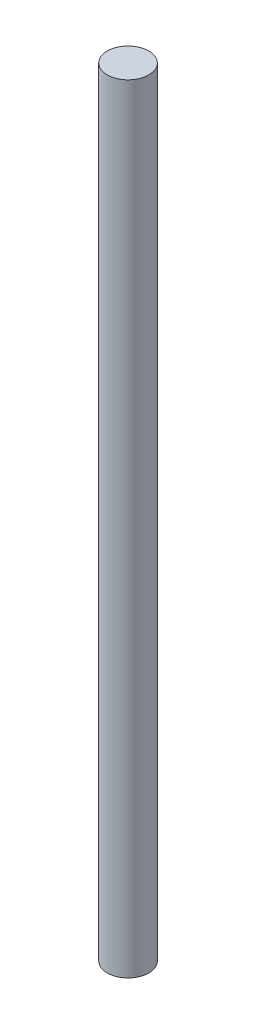
ISO-10303-21;
HEADER;
FILE_DESCRIPTION(('STEP AP214'),'2;1');
FILE_NAME('part.step','',(''),(''),'','','');
FILE_SCHEMA(('AUTOMOTIVE_DESIGN { 1 0 10303 214 1 1 1 1 }'));
ENDSEC;
DATA;
#1=APPLICATION_CONTEXT('core data for automotive mechanical design processes');
#2=APPLICATION_PROTOCOL_DEFINITION('international standard','automotive_design',2000,#1);
#3=PRODUCT_CONTEXT('',#1,'mechanical');
#4=PRODUCT('Part','Part','',(#3));
#5=PRODUCT_RELATED_PRODUCT_CATEGORY('part','',(#4));
#6=PRODUCT_DEFINITION_FORMATION('','',#4);
#7=PRODUCT_DEFINITION_CONTEXT('part definition',#1,'design');
#8=PRODUCT_DEFINITION('design','',#6,#7);
#9=PRODUCT_DEFINITION_SHAPE('','',#8);
#10=(LENGTH_UNIT() NAMED_UNIT(*) SI_UNIT(.MILLI.,.METRE.));
#11=(NAMED_UNIT(*) PLANE_ANGLE_UNIT() SI_UNIT($,.RADIAN.));
#12=(NAMED_UNIT(*) SI_UNIT($,.STERADIAN.) SOLID_ANGLE_UNIT());
#13=UNCERTAINTY_MEASURE_WITH_UNIT(LENGTH_MEASURE(1.E-05),#10,'distance_accuracy_value','');
#14=(GEOMETRIC_REPRESENTATION_CONTEXT(3) GLOBAL_UNCERTAINTY_ASSIGNED_CONTEXT((#13)) GLOBAL_UNIT_ASSIGNED_CONTEXT((#10,
#11,#12)) REPRESENTATION_CONTEXT('',''));
#15=CARTESIAN_POINT('',(0.,0.,0.));
#16=DIRECTION('',(0.,0.,1.));
#17=DIRECTION('',(1.,0.,0.));
#18=AXIS2_PLACEMENT_3D('',#15,#16,#17);
#19=CARTESIAN_POINT('',(0.,0.,0.));
#20=DIRECTION('',(0.,1.,0.));
#21=DIRECTION('',(0.,0.,1.));
#22=AXIS2_PLACEMENT_3D('',#19,#20,#21);
#23=PLANE('',#22);
#24=CARTESIAN_POINT('',(0.,0.,0.));
#25=DIRECTION('',(0.,-1.,0.));
#26=DIRECTION('',(0.,0.,-1.));
#27=AXIS2_PLACEMENT_3D('',#24,#25,#26);
#28=CIRCLE('',#27,1.6);
#29=CARTESIAN_POINT('',(0.,0.,-1.6));
#30=VERTEX_POINT('',#29);
#31=EDGE_CURVE('E10',#30,#30,#28,.T.);
#32=ORIENTED_EDGE('',*,*,#31,.T.);
#33=EDGE_LOOP('',(#32));
#34=FACE_BOUND('',#33,.T.);
#35=ADVANCED_FACE('F37',(#34),#23,.F.);
#36=CARTESIAN_POINT('',(0.,-10.2,0.));
#37=DIRECTION('',(0.,-1.,0.));
#38=DIRECTION('',(0.,0.,-1.));
#39=AXIS2_PLACEMENT_3D('',#36,#37,#38);
#40=CYLINDRICAL_SURFACE('',#39,1.6);
#41=ORIENTED_EDGE('',*,*,#31,.F.);
#42=EDGE_LOOP('',(#41));
#43=FACE_BOUND('',#42,.T.);
#44=CARTESIAN_POINT('',(0.,60.,0.));
#45=DIRECTION('',(0.,-1.,0.));
#46=DIRECTION('',(0.,0.,-1.));
#47=AXIS2_PLACEMENT_3D('',#44,#45,#46);
#48=CIRCLE('',#47,1.6);
#49=CARTESIAN_POINT('',(0.,60.,-1.6));
#50=VERTEX_POINT('',#49);
#51=EDGE_CURVE('E44',#50,#50,#48,.T.);
#52=ORIENTED_EDGE('',*,*,#51,.T.);
#53=EDGE_LOOP('',(#52));
#54=FACE_BOUND('',#53,.T.);
#55=ADVANCED_FACE('F51',(#43,#54),#40,.T.);
#56=CARTESIAN_POINT('',(-1.6,60.,0.));
#57=DIRECTION('',(0.,-1.,0.));
#58=DIRECTION('',(0.,0.,-1.));
#59=AXIS2_PLACEMENT_3D('',#56,#57,#58);
#60=PLANE('',#59);
#61=ORIENTED_EDGE('',*,*,#51,.F.);
#62=EDGE_LOOP('',(#61));
#63=FACE_BOUND('',#62,.T.);
#64=ADVANCED_FACE('F53',(#63),#60,.F.);
#65=CLOSED_SHELL('',(#35,#55,#64));
#66=MANIFOLD_SOLID_BREP('B2',#65);
#67=ADVANCED_BREP_SHAPE_REPRESENTATION('',(#18,#66),#14);
#68=SHAPE_DEFINITION_REPRESENTATION(#9,#67);
ENDSEC;
END-ISO-10303-21;
